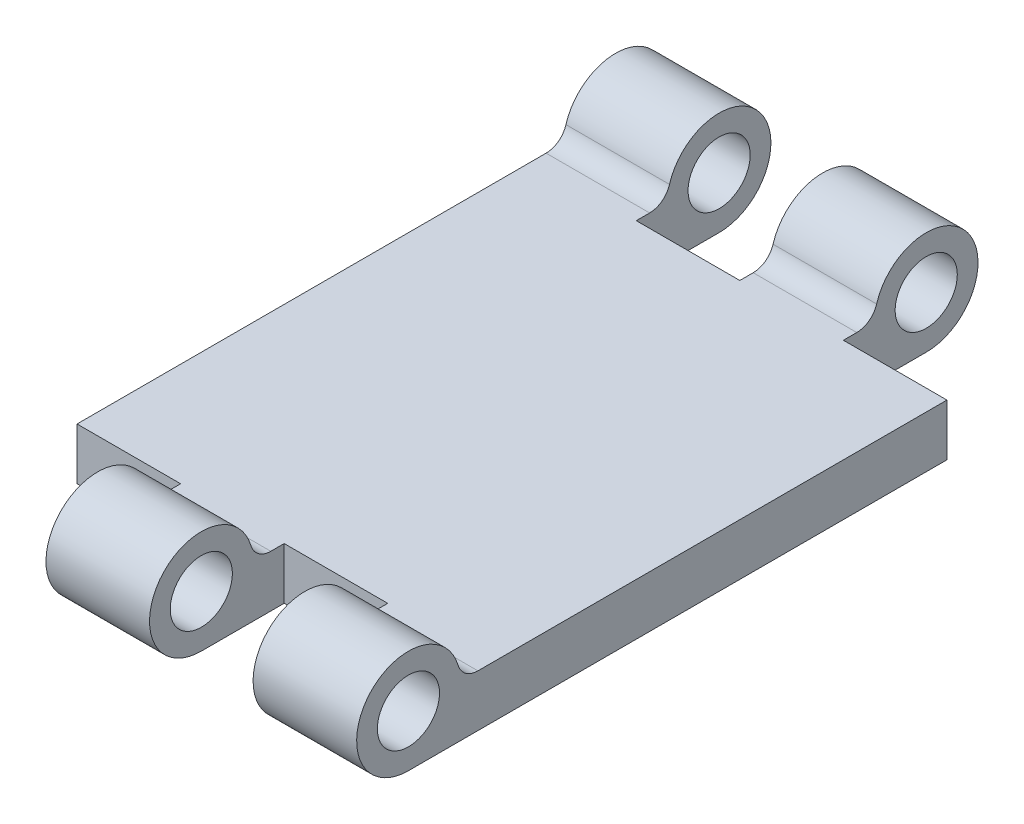
ISO-10303-21;
HEADER;
FILE_DESCRIPTION(('STEP AP214'),'2;1');
FILE_NAME('part.step','',(''),(''),'','','');
FILE_SCHEMA(('AUTOMOTIVE_DESIGN { 1 0 10303 214 1 1 1 1 }'));
ENDSEC;
DATA;
#1=APPLICATION_CONTEXT('core data for automotive mechanical design processes');
#2=APPLICATION_PROTOCOL_DEFINITION('international standard','automotive_design',2000,#1);
#3=PRODUCT_CONTEXT('',#1,'mechanical');
#4=PRODUCT('Part','Part','',(#3));
#5=PRODUCT_RELATED_PRODUCT_CATEGORY('part','',(#4));
#6=PRODUCT_DEFINITION_FORMATION('','',#4);
#7=PRODUCT_DEFINITION_CONTEXT('part definition',#1,'design');
#8=PRODUCT_DEFINITION('design','',#6,#7);
#9=PRODUCT_DEFINITION_SHAPE('','',#8);
#10=(LENGTH_UNIT() NAMED_UNIT(*) SI_UNIT(.MILLI.,.METRE.));
#11=(NAMED_UNIT(*) PLANE_ANGLE_UNIT() SI_UNIT($,.RADIAN.));
#12=(NAMED_UNIT(*) SI_UNIT($,.STERADIAN.) SOLID_ANGLE_UNIT());
#13=UNCERTAINTY_MEASURE_WITH_UNIT(LENGTH_MEASURE(1.E-05),#10,'distance_accuracy_value','');
#14=(GEOMETRIC_REPRESENTATION_CONTEXT(3) GLOBAL_UNCERTAINTY_ASSIGNED_CONTEXT((#13)) GLOBAL_UNIT_ASSIGNED_CONTEXT((#10,
#11,#12)) REPRESENTATION_CONTEXT('',''));
#15=CARTESIAN_POINT('',(0.,0.,0.));
#16=DIRECTION('',(0.,0.,1.));
#17=DIRECTION('',(1.,0.,0.));
#18=AXIS2_PLACEMENT_3D('',#15,#16,#17);
#19=CARTESIAN_POINT('',(500.,-125.,0.));
#20=DIRECTION('',(0.,1.,0.));
#21=DIRECTION('',(0.,0.,1.));
#22=AXIS2_PLACEMENT_3D('',#19,#20,#21);
#23=PLANE('',#22);
#24=DIRECTION('',(0.,0.,1.));
#25=VECTOR('',#24,1.);
#26=CARTESIAN_POINT('',(-250.,-125.,0.));
#27=LINE('',#26,#25);
#28=CARTESIAN_POINT('',(-250.,-125.,1300.));
#29=VERTEX_POINT('',#28);
#30=CARTESIAN_POINT('',(-250.,-125.,1500.));
#31=VERTEX_POINT('',#30);
#32=EDGE_CURVE('E360',#29,#31,#27,.T.);
#33=ORIENTED_EDGE('',*,*,#32,.F.);
#34=DIRECTION('',(1.,0.,0.));
#35=VECTOR('',#34,1.);
#36=CARTESIAN_POINT('',(500.,-125.,1300.));
#37=LINE('',#36,#35);
#38=CARTESIAN_POINT('',(-500.,-125.,1300.));
#39=VERTEX_POINT('',#38);
#40=EDGE_CURVE('E366',#39,#29,#37,.T.);
#41=ORIENTED_EDGE('',*,*,#40,.F.);
#42=DIRECTION('',(0.,0.,-1.));
#43=VECTOR('',#42,1.);
#44=CARTESIAN_POINT('',(-500.,-125.,0.));
#45=LINE('',#44,#43);
#46=CARTESIAN_POINT('',(-500.,-125.,0.));
#47=VERTEX_POINT('',#46);
#48=EDGE_CURVE('E279',#39,#47,#45,.T.);
#49=ORIENTED_EDGE('',*,*,#48,.T.);
#50=DIRECTION('',(1.,0.,0.));
#51=VECTOR('',#50,1.);
#52=CARTESIAN_POINT('',(-500.,-125.,0.));
#53=LINE('',#52,#51);
#54=CARTESIAN_POINT('',(-250.,-125.,0.));
#55=VERTEX_POINT('',#54);
#56=EDGE_CURVE('E332',#47,#55,#53,.T.);
#57=ORIENTED_EDGE('',*,*,#56,.T.);
#58=DIRECTION('',(0.,0.,-1.));
#59=VECTOR('',#58,1.);
#60=CARTESIAN_POINT('',(-250.,-125.,0.));
#61=LINE('',#60,#59);
#62=CARTESIAN_POINT('',(-250.,-125.,200.));
#63=VERTEX_POINT('',#62);
#64=EDGE_CURVE('E254',#63,#55,#61,.T.);
#65=ORIENTED_EDGE('',*,*,#64,.F.);
#66=DIRECTION('',(-1.,0.,0.));
#67=VECTOR('',#66,1.);
#68=CARTESIAN_POINT('',(500.,-125.,200.));
#69=LINE('',#68,#67);
#70=CARTESIAN_POINT('',(0.,-125.,200.));
#71=VERTEX_POINT('',#70);
#72=EDGE_CURVE('E313',#71,#63,#69,.T.);
#73=ORIENTED_EDGE('',*,*,#72,.F.);
#74=DIRECTION('',(0.,0.,1.));
#75=VECTOR('',#74,1.);
#76=CARTESIAN_POINT('',(0.,-125.,0.));
#77=LINE('',#76,#75);
#78=CARTESIAN_POINT('',(0.,-125.,0.));
#79=VERTEX_POINT('',#78);
#80=EDGE_CURVE('E305',#79,#71,#77,.T.);
#81=ORIENTED_EDGE('',*,*,#80,.F.);
#82=DIRECTION('',(-1.,0.,0.));
#83=VECTOR('',#82,1.);
#84=CARTESIAN_POINT('',(250.,-125.,0.));
#85=LINE('',#84,#83);
#86=CARTESIAN_POINT('',(250.,-125.,0.));
#87=VERTEX_POINT('',#86);
#88=EDGE_CURVE('E267',#79,#87,#85,.F.);
#89=ORIENTED_EDGE('',*,*,#88,.T.);
#90=DIRECTION('',(0.,0.,-1.));
#91=VECTOR('',#90,1.);
#92=CARTESIAN_POINT('',(250.,-125.,0.));
#93=LINE('',#92,#91);
#94=CARTESIAN_POINT('',(250.,-125.,200.));
#95=VERTEX_POINT('',#94);
#96=EDGE_CURVE('E253',#95,#87,#93,.T.);
#97=ORIENTED_EDGE('',*,*,#96,.F.);
#98=DIRECTION('',(-1.,0.,0.));
#99=VECTOR('',#98,1.);
#100=CARTESIAN_POINT('',(500.,-125.,200.));
#101=LINE('',#100,#99);
#102=CARTESIAN_POINT('',(500.,-125.,200.));
#103=VERTEX_POINT('',#102);
#104=EDGE_CURVE('E311',#103,#95,#101,.T.);
#105=ORIENTED_EDGE('',*,*,#104,.F.);
#106=DIRECTION('',(0.,0.,-1.));
#107=VECTOR('',#106,1.);
#108=CARTESIAN_POINT('',(500.,-125.,0.));
#109=LINE('',#108,#107);
#110=CARTESIAN_POINT('',(500.,-125.,1500.));
#111=VERTEX_POINT('',#110);
#112=EDGE_CURVE('E280',#111,#103,#109,.T.);
#113=ORIENTED_EDGE('',*,*,#112,.F.);
#114=DIRECTION('',(-1.,0.,0.));
#115=VECTOR('',#114,1.);
#116=CARTESIAN_POINT('',(500.,-125.,1500.));
#117=LINE('',#116,#115);
#118=CARTESIAN_POINT('',(250.,-125.,1500.));
#119=VERTEX_POINT('',#118);
#120=EDGE_CURVE('E287',#111,#119,#117,.T.);
#121=ORIENTED_EDGE('',*,*,#120,.T.);
#122=DIRECTION('',(0.,0.,1.));
#123=VECTOR('',#122,1.);
#124=CARTESIAN_POINT('',(250.,-125.,0.));
#125=LINE('',#124,#123);
#126=CARTESIAN_POINT('',(250.,-125.,1300.));
#127=VERTEX_POINT('',#126);
#128=EDGE_CURVE('E183',#127,#119,#125,.T.);
#129=ORIENTED_EDGE('',*,*,#128,.F.);
#130=DIRECTION('',(1.,0.,0.));
#131=VECTOR('',#130,1.);
#132=CARTESIAN_POINT('',(500.,-125.,1300.));
#133=LINE('',#132,#131);
#134=CARTESIAN_POINT('',(0.,-125.,1300.));
#135=VERTEX_POINT('',#134);
#136=EDGE_CURVE('E192',#135,#127,#133,.T.);
#137=ORIENTED_EDGE('',*,*,#136,.F.);
#138=DIRECTION('',(0.,0.,-1.));
#139=VECTOR('',#138,1.);
#140=CARTESIAN_POINT('',(0.,-125.,0.));
#141=LINE('',#140,#139);
#142=CARTESIAN_POINT('',(0.,-125.,1500.));
#143=VERTEX_POINT('',#142);
#144=EDGE_CURVE('E361',#143,#135,#141,.T.);
#145=ORIENTED_EDGE('',*,*,#144,.F.);
#146=DIRECTION('',(1.,0.,0.));
#147=VECTOR('',#146,1.);
#148=CARTESIAN_POINT('',(-250.,-125.,1500.));
#149=LINE('',#148,#147);
#150=EDGE_CURVE('E274',#31,#143,#149,.T.);
#151=ORIENTED_EDGE('',*,*,#150,.F.);
#152=EDGE_LOOP('',(#33,#41,#49,#57,#65,#73,#81,#89,#97,#105,#113,#121,#129,#137,#145,#151));
#153=FACE_BOUND('',#152,.T.);
#154=ADVANCED_FACE('F35',(#153),#23,.F.);
#155=CARTESIAN_POINT('',(500.,0.,0.));
#156=DIRECTION('',(0.,-1.,0.));
#157=DIRECTION('',(0.,0.,-1.));
#158=AXIS2_PLACEMENT_3D('',#155,#156,#157);
#159=PLANE('',#158);
#160=DIRECTION('',(0.,0.,-1.));
#161=VECTOR('',#160,1.);
#162=CARTESIAN_POINT('',(-250.,0.,0.));
#163=LINE('',#162,#161);
#164=CARTESIAN_POINT('',(-250.,-1.47850983697853E-13,1332.29490168752));
#165=VERTEX_POINT('',#164);
#166=CARTESIAN_POINT('',(-250.,-1.66533453693773E-13,1300.));
#167=VERTEX_POINT('',#166);
#168=EDGE_CURVE('E395',#165,#167,#163,.T.);
#169=ORIENTED_EDGE('',*,*,#168,.F.);
#170=DIRECTION('',(1.,0.,0.));
#171=VECTOR('',#170,1.);
#172=CARTESIAN_POINT('',(500.,-1.47850983697853E-13,1332.29490168752));
#173=LINE('',#172,#171);
#174=CARTESIAN_POINT('',(0.,-1.47850983697853E-13,1332.29490168752));
#175=VERTEX_POINT('',#174);
#176=EDGE_CURVE('E217',#165,#175,#173,.T.);
#177=ORIENTED_EDGE('',*,*,#176,.T.);
#178=DIRECTION('',(0.,0.,1.));
#179=VECTOR('',#178,1.);
#180=CARTESIAN_POINT('',(0.,0.,0.));
#181=LINE('',#180,#179);
#182=CARTESIAN_POINT('',(0.,-1.66533453693773E-13,1300.));
#183=VERTEX_POINT('',#182);
#184=EDGE_CURVE('E199',#183,#175,#181,.T.);
#185=ORIENTED_EDGE('',*,*,#184,.F.);
#186=DIRECTION('',(-1.,0.,0.));
#187=VECTOR('',#186,1.);
#188=CARTESIAN_POINT('',(500.,-1.43895998899814E-13,1300.));
#189=LINE('',#188,#187);
#190=CARTESIAN_POINT('',(250.,-1.66533453693773E-13,1300.));
#191=VERTEX_POINT('',#190);
#192=EDGE_CURVE('E189',#191,#183,#189,.T.);
#193=ORIENTED_EDGE('',*,*,#192,.F.);
#194=DIRECTION('',(0.,0.,-1.));
#195=VECTOR('',#194,1.);
#196=CARTESIAN_POINT('',(250.,0.,0.));
#197=LINE('',#196,#195);
#198=CARTESIAN_POINT('',(250.,-1.47850983697853E-13,1332.29490168752));
#199=VERTEX_POINT('',#198);
#200=EDGE_CURVE('E172',#199,#191,#197,.T.);
#201=ORIENTED_EDGE('',*,*,#200,.F.);
#202=DIRECTION('',(1.,0.,0.));
#203=VECTOR('',#202,1.);
#204=CARTESIAN_POINT('',(500.,-1.47850983697853E-13,1332.29490168752));
#205=LINE('',#204,#203);
#206=CARTESIAN_POINT('',(500.,-1.47850983697853E-13,1332.29490168752));
#207=VERTEX_POINT('',#206);
#208=EDGE_CURVE('E215',#199,#207,#205,.T.);
#209=ORIENTED_EDGE('',*,*,#208,.T.);
#210=DIRECTION('',(0.,0.,1.));
#211=VECTOR('',#210,1.);
#212=CARTESIAN_POINT('',(500.,0.,0.));
#213=LINE('',#212,#211);
#214=CARTESIAN_POINT('',(500.,0.,200.));
#215=VERTEX_POINT('',#214);
#216=EDGE_CURVE('E283',#215,#207,#213,.T.);
#217=ORIENTED_EDGE('',*,*,#216,.F.);
#218=DIRECTION('',(1.,0.,0.));
#219=VECTOR('',#218,1.);
#220=CARTESIAN_POINT('',(500.,0.,200.));
#221=LINE('',#220,#219);
#222=CARTESIAN_POINT('',(250.,0.,200.));
#223=VERTEX_POINT('',#222);
#224=EDGE_CURVE('E252',#223,#215,#221,.T.);
#225=ORIENTED_EDGE('',*,*,#224,.F.);
#226=DIRECTION('',(0.,0.,1.));
#227=VECTOR('',#226,1.);
#228=CARTESIAN_POINT('',(250.,0.,0.));
#229=LINE('',#228,#227);
#230=CARTESIAN_POINT('',(250.,0.,167.705098312484));
#231=VERTEX_POINT('',#230);
#232=EDGE_CURVE('E241',#231,#223,#229,.T.);
#233=ORIENTED_EDGE('',*,*,#232,.F.);
#234=DIRECTION('',(1.,0.,0.));
#235=VECTOR('',#234,1.);
#236=CARTESIAN_POINT('',(0.,0.,167.705098312484));
#237=LINE('',#236,#235);
#238=CARTESIAN_POINT('',(0.,0.,167.705098312484));
#239=VERTEX_POINT('',#238);
#240=EDGE_CURVE('E212',#231,#239,#237,.F.);
#241=ORIENTED_EDGE('',*,*,#240,.T.);
#242=DIRECTION('',(0.,0.,-1.));
#243=VECTOR('',#242,1.);
#244=CARTESIAN_POINT('',(0.,0.,0.));
#245=LINE('',#244,#243);
#246=CARTESIAN_POINT('',(0.,0.,200.));
#247=VERTEX_POINT('',#246);
#248=EDGE_CURVE('E262',#247,#239,#245,.T.);
#249=ORIENTED_EDGE('',*,*,#248,.F.);
#250=DIRECTION('',(1.,0.,0.));
#251=VECTOR('',#250,1.);
#252=CARTESIAN_POINT('',(500.,0.,200.));
#253=LINE('',#252,#251);
#254=CARTESIAN_POINT('',(-250.,0.,200.));
#255=VERTEX_POINT('',#254);
#256=EDGE_CURVE('E206',#255,#247,#253,.T.);
#257=ORIENTED_EDGE('',*,*,#256,.F.);
#258=DIRECTION('',(0.,0.,1.));
#259=VECTOR('',#258,1.);
#260=CARTESIAN_POINT('',(-250.,0.,0.));
#261=LINE('',#260,#259);
#262=CARTESIAN_POINT('',(-250.,0.,167.705098312484));
#263=VERTEX_POINT('',#262);
#264=EDGE_CURVE('E377',#263,#255,#261,.T.);
#265=ORIENTED_EDGE('',*,*,#264,.F.);
#266=DIRECTION('',(1.,0.,0.));
#267=VECTOR('',#266,1.);
#268=CARTESIAN_POINT('',(500.,0.,167.705098312484));
#269=LINE('',#268,#267);
#270=CARTESIAN_POINT('',(-500.,0.,167.705098312484));
#271=VERTEX_POINT('',#270);
#272=EDGE_CURVE('E204',#263,#271,#269,.F.);
#273=ORIENTED_EDGE('',*,*,#272,.T.);
#274=DIRECTION('',(0.,0.,1.));
#275=VECTOR('',#274,1.);
#276=CARTESIAN_POINT('',(-500.,0.,0.));
#277=LINE('',#276,#275);
#278=CARTESIAN_POINT('',(-500.,-1.43895998899814E-13,1300.));
#279=VERTEX_POINT('',#278);
#280=EDGE_CURVE('E284',#271,#279,#277,.T.);
#281=ORIENTED_EDGE('',*,*,#280,.T.);
#282=DIRECTION('',(-1.,0.,0.));
#283=VECTOR('',#282,1.);
#284=CARTESIAN_POINT('',(500.,-1.43895998899814E-13,1300.));
#285=LINE('',#284,#283);
#286=EDGE_CURVE('E363',#167,#279,#285,.T.);
#287=ORIENTED_EDGE('',*,*,#286,.F.);
#288=EDGE_LOOP('',(#169,#177,#185,#193,#201,#209,#217,#225,#233,#241,#249,#257,#265,#273,#281,#287));
#289=FACE_BOUND('',#288,.T.);
#290=ADVANCED_FACE('F197',(#289),#159,.F.);
#291=CARTESIAN_POINT('',(-500.,0.,0.));
#292=DIRECTION('',(1.,0.,0.));
#293=DIRECTION('',(0.,0.,-1.));
#294=AXIS2_PLACEMENT_3D('',#291,#292,#293);
#295=PLANE('',#294);
#296=CARTESIAN_POINT('',(-500.,0.,0.));
#297=DIRECTION('',(1.,0.,0.));
#298=DIRECTION('',(0.,0.,-1.));
#299=AXIS2_PLACEMENT_3D('',#296,#297,#298);
#300=CIRCLE('',#299,75.);
#301=CARTESIAN_POINT('',(-500.,0.,-75.));
#302=VERTEX_POINT('',#301);
#303=EDGE_CURVE('E326',#302,#302,#300,.T.);
#304=ORIENTED_EDGE('',*,*,#303,.T.);
#305=EDGE_LOOP('',(#304));
#306=FACE_BOUND('',#305,.T.);
#307=DIRECTION('',(0.,-1.,0.));
#308=VECTOR('',#307,1.);
#309=CARTESIAN_POINT('',(-500.,0.,1300.));
#310=LINE('',#309,#308);
#311=EDGE_CURVE('E201',#279,#39,#310,.T.);
#312=ORIENTED_EDGE('',*,*,#311,.F.);
#313=ORIENTED_EDGE('',*,*,#280,.F.);
#314=CARTESIAN_POINT('',(-500.,50.,167.705098312484));
#315=DIRECTION('',(1.,0.,0.));
#316=DIRECTION('',(0.,0.,-1.));
#317=AXIS2_PLACEMENT_3D('',#314,#315,#316);
#318=CIRCLE('',#317,50.);
#319=CARTESIAN_POINT('',(-500.,35.7142857142857,119.789355937489));
#320=VERTEX_POINT('',#319);
#321=EDGE_CURVE('E43',#271,#320,#318,.T.);
#322=ORIENTED_EDGE('',*,*,#321,.T.);
#323=CARTESIAN_POINT('',(-500.,0.,0.));
#324=DIRECTION('',(1.,0.,0.));
#325=DIRECTION('',(0.,0.,-1.));
#326=AXIS2_PLACEMENT_3D('',#323,#324,#325);
#327=CIRCLE('',#326,125.);
#328=EDGE_CURVE('E329',#47,#320,#327,.T.);
#329=ORIENTED_EDGE('',*,*,#328,.F.);
#330=ORIENTED_EDGE('',*,*,#48,.F.);
#331=EDGE_LOOP('',(#312,#313,#322,#329,#330));
#332=FACE_BOUND('',#331,.T.);
#333=ADVANCED_FACE('F387',(#306,#332),#295,.F.);
#334=CARTESIAN_POINT('',(500.,0.,0.));
#335=DIRECTION('',(1.,0.,0.));
#336=DIRECTION('',(0.,0.,-1.));
#337=AXIS2_PLACEMENT_3D('',#334,#335,#336);
#338=PLANE('',#337);
#339=CARTESIAN_POINT('',(500.,0.,1500.));
#340=DIRECTION('',(1.,0.,0.));
#341=DIRECTION('',(0.,0.,-1.));
#342=AXIS2_PLACEMENT_3D('',#339,#340,#341);
#343=CIRCLE('',#342,75.);
#344=CARTESIAN_POINT('',(500.,0.,1425.));
#345=VERTEX_POINT('',#344);
#346=EDGE_CURVE('E316',#345,#345,#343,.T.);
#347=ORIENTED_EDGE('',*,*,#346,.F.);
#348=EDGE_LOOP('',(#347));
#349=FACE_BOUND('',#348,.T.);
#350=ORIENTED_EDGE('',*,*,#112,.T.);
#351=DIRECTION('',(0.,1.,0.));
#352=VECTOR('',#351,1.);
#353=CARTESIAN_POINT('',(500.,0.,200.));
#354=LINE('',#353,#352);
#355=EDGE_CURVE('E292',#103,#215,#354,.T.);
#356=ORIENTED_EDGE('',*,*,#355,.T.);
#357=ORIENTED_EDGE('',*,*,#216,.T.);
#358=CARTESIAN_POINT('',(500.,49.9999999999999,1332.29490168752));
#359=DIRECTION('',(1.,0.,0.));
#360=DIRECTION('',(0.,0.,-1.));
#361=AXIS2_PLACEMENT_3D('',#358,#359,#360);
#362=CIRCLE('',#361,50.);
#363=CARTESIAN_POINT('',(500.,35.7142857142856,1380.21064406251));
#364=VERTEX_POINT('',#363);
#365=EDGE_CURVE('E230',#207,#364,#362,.F.);
#366=ORIENTED_EDGE('',*,*,#365,.T.);
#367=CARTESIAN_POINT('',(500.,0.,1500.));
#368=DIRECTION('',(1.,0.,0.));
#369=DIRECTION('',(0.,0.,-1.));
#370=AXIS2_PLACEMENT_3D('',#367,#368,#369);
#371=CIRCLE('',#370,125.);
#372=EDGE_CURVE('E319',#364,#111,#371,.T.);
#373=ORIENTED_EDGE('',*,*,#372,.T.);
#374=EDGE_LOOP('',(#350,#356,#357,#366,#373));
#375=FACE_BOUND('',#374,.T.);
#376=ADVANCED_FACE('F560',(#349,#375),#338,.T.);
#377=CARTESIAN_POINT('',(250.,0.,0.));
#378=DIRECTION('',(-1.,0.,0.));
#379=DIRECTION('',(0.,0.,1.));
#380=AXIS2_PLACEMENT_3D('',#377,#378,#379);
#381=CYLINDRICAL_SURFACE('',#380,75.);
#382=CARTESIAN_POINT('',(250.,0.,0.));
#383=DIRECTION('',(1.,0.,0.));
#384=DIRECTION('',(0.,0.,-1.));
#385=AXIS2_PLACEMENT_3D('',#382,#383,#384);
#386=CIRCLE('',#385,75.);
#387=CARTESIAN_POINT('',(250.,0.,-75.));
#388=VERTEX_POINT('',#387);
#389=EDGE_CURVE('E268',#388,#388,#386,.T.);
#390=ORIENTED_EDGE('',*,*,#389,.T.);
#391=EDGE_LOOP('',(#390));
#392=FACE_BOUND('',#391,.T.);
#393=CARTESIAN_POINT('',(0.,0.,0.));
#394=DIRECTION('',(1.,0.,0.));
#395=DIRECTION('',(0.,0.,-1.));
#396=AXIS2_PLACEMENT_3D('',#393,#394,#395);
#397=CIRCLE('',#396,75.);
#398=CARTESIAN_POINT('',(0.,0.,-75.));
#399=VERTEX_POINT('',#398);
#400=EDGE_CURVE('E269',#399,#399,#397,.T.);
#401=ORIENTED_EDGE('',*,*,#400,.F.);
#402=EDGE_LOOP('',(#401));
#403=FACE_BOUND('',#402,.T.);
#404=ADVANCED_FACE('F553',(#392,#403),#381,.F.);
#405=CARTESIAN_POINT('',(250.,0.,0.));
#406=DIRECTION('',(-1.,0.,0.));
#407=DIRECTION('',(0.,0.,1.));
#408=AXIS2_PLACEMENT_3D('',#405,#406,#407);
#409=CYLINDRICAL_SURFACE('',#408,125.);
#410=CARTESIAN_POINT('',(0.,0.,0.));
#411=DIRECTION('',(1.,0.,0.));
#412=DIRECTION('',(0.,0.,-1.));
#413=AXIS2_PLACEMENT_3D('',#410,#411,#412);
#414=CIRCLE('',#413,125.);
#415=CARTESIAN_POINT('',(0.,35.7142857142857,119.789355937489));
#416=VERTEX_POINT('',#415);
#417=EDGE_CURVE('E261',#79,#416,#414,.T.);
#418=ORIENTED_EDGE('',*,*,#417,.T.);
#419=DIRECTION('',(-1.,0.,0.));
#420=VECTOR('',#419,1.);
#421=CARTESIAN_POINT('',(250.,35.7142857142857,119.789355937489));
#422=LINE('',#421,#420);
#423=CARTESIAN_POINT('',(250.,35.7142857142857,119.789355937489));
#424=VERTEX_POINT('',#423);
#425=EDGE_CURVE('E222',#416,#424,#422,.F.);
#426=ORIENTED_EDGE('',*,*,#425,.T.);
#427=CARTESIAN_POINT('',(250.,0.,0.));
#428=DIRECTION('',(1.,0.,0.));
#429=DIRECTION('',(0.,0.,-1.));
#430=AXIS2_PLACEMENT_3D('',#427,#428,#429);
#431=CIRCLE('',#430,125.);
#432=EDGE_CURVE('E244',#87,#424,#431,.T.);
#433=ORIENTED_EDGE('',*,*,#432,.F.);
#434=ORIENTED_EDGE('',*,*,#88,.F.);
#435=EDGE_LOOP('',(#418,#426,#433,#434));
#436=FACE_BOUND('',#435,.T.);
#437=ADVANCED_FACE('F265',(#436),#409,.T.);
#438=CARTESIAN_POINT('',(250.,0.,0.));
#439=DIRECTION('',(1.,0.,0.));
#440=DIRECTION('',(0.,0.,-1.));
#441=AXIS2_PLACEMENT_3D('',#438,#439,#440);
#442=PLANE('',#441);
#443=ORIENTED_EDGE('',*,*,#389,.F.);
#444=EDGE_LOOP('',(#443));
#445=FACE_BOUND('',#444,.T.);
#446=ORIENTED_EDGE('',*,*,#432,.T.);
#447=CARTESIAN_POINT('',(250.,50.,167.705098312484));
#448=DIRECTION('',(1.,0.,0.));
#449=DIRECTION('',(0.,0.,-1.));
#450=AXIS2_PLACEMENT_3D('',#447,#448,#449);
#451=CIRCLE('',#450,50.);
#452=EDGE_CURVE('E234',#424,#231,#451,.F.);
#453=ORIENTED_EDGE('',*,*,#452,.T.);
#454=ORIENTED_EDGE('',*,*,#232,.T.);
#455=DIRECTION('',(0.,-1.,0.));
#456=VECTOR('',#455,1.);
#457=CARTESIAN_POINT('',(250.,250.,200.));
#458=LINE('',#457,#456);
#459=EDGE_CURVE('E373',#223,#95,#458,.T.);
#460=ORIENTED_EDGE('',*,*,#459,.T.);
#461=ORIENTED_EDGE('',*,*,#96,.T.);
#462=EDGE_LOOP('',(#446,#453,#454,#460,#461));
#463=FACE_BOUND('',#462,.T.);
#464=ADVANCED_FACE('F239',(#445,#463),#442,.T.);
#465=CARTESIAN_POINT('',(0.,0.,0.));
#466=DIRECTION('',(1.,0.,0.));
#467=DIRECTION('',(0.,0.,-1.));
#468=AXIS2_PLACEMENT_3D('',#465,#466,#467);
#469=PLANE('',#468);
#470=ORIENTED_EDGE('',*,*,#400,.T.);
#471=EDGE_LOOP('',(#470));
#472=FACE_BOUND('',#471,.T.);
#473=ORIENTED_EDGE('',*,*,#417,.F.);
#474=ORIENTED_EDGE('',*,*,#80,.T.);
#475=DIRECTION('',(0.,-1.,0.));
#476=VECTOR('',#475,1.);
#477=CARTESIAN_POINT('',(0.,250.,200.));
#478=LINE('',#477,#476);
#479=EDGE_CURVE('E300',#247,#71,#478,.T.);
#480=ORIENTED_EDGE('',*,*,#479,.F.);
#481=ORIENTED_EDGE('',*,*,#248,.T.);
#482=CARTESIAN_POINT('',(0.,50.,167.705098312484));
#483=DIRECTION('',(1.,0.,0.));
#484=DIRECTION('',(0.,0.,-1.));
#485=AXIS2_PLACEMENT_3D('',#482,#483,#484);
#486=CIRCLE('',#485,50.);
#487=EDGE_CURVE('E232',#239,#416,#486,.T.);
#488=ORIENTED_EDGE('',*,*,#487,.T.);
#489=EDGE_LOOP('',(#473,#474,#480,#481,#488));
#490=FACE_BOUND('',#489,.T.);
#491=ADVANCED_FACE('F260',(#472,#490),#469,.F.);
#492=CARTESIAN_POINT('',(-250.,0.,1500.));
#493=DIRECTION('',(1.,0.,0.));
#494=DIRECTION('',(0.,0.,-1.));
#495=AXIS2_PLACEMENT_3D('',#492,#493,#494);
#496=CYLINDRICAL_SURFACE('',#495,75.);
#497=CARTESIAN_POINT('',(-250.,0.,1500.));
#498=DIRECTION('',(1.,0.,0.));
#499=DIRECTION('',(0.,0.,-1.));
#500=AXIS2_PLACEMENT_3D('',#497,#498,#499);
#501=CIRCLE('',#500,75.);
#502=CARTESIAN_POINT('',(-250.,0.,1425.));
#503=VERTEX_POINT('',#502);
#504=EDGE_CURVE('E339',#503,#503,#501,.T.);
#505=ORIENTED_EDGE('',*,*,#504,.F.);
#506=EDGE_LOOP('',(#505));
#507=FACE_BOUND('',#506,.T.);
#508=CARTESIAN_POINT('',(0.,0.,1500.));
#509=DIRECTION('',(1.,0.,0.));
#510=DIRECTION('',(0.,0.,-1.));
#511=AXIS2_PLACEMENT_3D('',#508,#509,#510);
#512=CIRCLE('',#511,75.);
#513=CARTESIAN_POINT('',(0.,0.,1425.));
#514=VERTEX_POINT('',#513);
#515=EDGE_CURVE('E338',#514,#514,#512,.T.);
#516=ORIENTED_EDGE('',*,*,#515,.T.);
#517=EDGE_LOOP('',(#516));
#518=FACE_BOUND('',#517,.T.);
#519=ADVANCED_FACE('F416',(#507,#518),#496,.F.);
#520=CARTESIAN_POINT('',(-250.,0.,1500.));
#521=DIRECTION('',(1.,0.,0.));
#522=DIRECTION('',(0.,0.,-1.));
#523=AXIS2_PLACEMENT_3D('',#520,#521,#522);
#524=CYLINDRICAL_SURFACE('',#523,125.);
#525=CARTESIAN_POINT('',(0.,0.,1500.));
#526=DIRECTION('',(1.,0.,0.));
#527=DIRECTION('',(0.,0.,-1.));
#528=AXIS2_PLACEMENT_3D('',#525,#526,#527);
#529=CIRCLE('',#528,125.);
#530=CARTESIAN_POINT('',(0.,35.7142857142856,1380.21064406251));
#531=VERTEX_POINT('',#530);
#532=EDGE_CURVE('E343',#531,#143,#529,.T.);
#533=ORIENTED_EDGE('',*,*,#532,.F.);
#534=DIRECTION('',(1.,0.,0.));
#535=VECTOR('',#534,1.);
#536=CARTESIAN_POINT('',(-250.,35.7142857142856,1380.21064406251));
#537=LINE('',#536,#535);
#538=CARTESIAN_POINT('',(-250.,35.7142857142856,1380.21064406251));
#539=VERTEX_POINT('',#538);
#540=EDGE_CURVE('E200',#531,#539,#537,.F.);
#541=ORIENTED_EDGE('',*,*,#540,.T.);
#542=CARTESIAN_POINT('',(-250.,0.,1500.));
#543=DIRECTION('',(1.,0.,0.));
#544=DIRECTION('',(0.,0.,-1.));
#545=AXIS2_PLACEMENT_3D('',#542,#543,#544);
#546=CIRCLE('',#545,125.);
#547=EDGE_CURVE('E342',#539,#31,#546,.T.);
#548=ORIENTED_EDGE('',*,*,#547,.T.);
#549=ORIENTED_EDGE('',*,*,#150,.T.);
#550=EDGE_LOOP('',(#533,#541,#548,#549));
#551=FACE_BOUND('',#550,.T.);
#552=ADVANCED_FACE('F352',(#551),#524,.T.);
#553=CARTESIAN_POINT('',(-250.,0.,0.));
#554=DIRECTION('',(1.,0.,0.));
#555=DIRECTION('',(0.,0.,-1.));
#556=AXIS2_PLACEMENT_3D('',#553,#554,#555);
#557=PLANE('',#556);
#558=ORIENTED_EDGE('',*,*,#504,.T.);
#559=EDGE_LOOP('',(#558));
#560=FACE_BOUND('',#559,.T.);
#561=ORIENTED_EDGE('',*,*,#547,.F.);
#562=CARTESIAN_POINT('',(-250.,49.9999999999999,1332.29490168752));
#563=DIRECTION('',(1.,0.,0.));
#564=DIRECTION('',(0.,0.,-1.));
#565=AXIS2_PLACEMENT_3D('',#562,#563,#564);
#566=CIRCLE('',#565,50.);
#567=EDGE_CURVE('E225',#539,#165,#566,.T.);
#568=ORIENTED_EDGE('',*,*,#567,.T.);
#569=ORIENTED_EDGE('',*,*,#168,.T.);
#570=DIRECTION('',(0.,-1.,0.));
#571=VECTOR('',#570,1.);
#572=CARTESIAN_POINT('',(-250.,250.,1300.));
#573=LINE('',#572,#571);
#574=EDGE_CURVE('E193',#167,#29,#573,.T.);
#575=ORIENTED_EDGE('',*,*,#574,.T.);
#576=ORIENTED_EDGE('',*,*,#32,.T.);
#577=EDGE_LOOP('',(#561,#568,#569,#575,#576));
#578=FACE_BOUND('',#577,.T.);
#579=ADVANCED_FACE('F406',(#560,#578),#557,.F.);
#580=CARTESIAN_POINT('',(0.,0.,0.));
#581=DIRECTION('',(1.,0.,0.));
#582=DIRECTION('',(0.,0.,-1.));
#583=AXIS2_PLACEMENT_3D('',#580,#581,#582);
#584=PLANE('',#583);
#585=ORIENTED_EDGE('',*,*,#515,.F.);
#586=EDGE_LOOP('',(#585));
#587=FACE_BOUND('',#586,.T.);
#588=ORIENTED_EDGE('',*,*,#184,.T.);
#589=CARTESIAN_POINT('',(0.,49.9999999999999,1332.29490168752));
#590=DIRECTION('',(1.,0.,0.));
#591=DIRECTION('',(0.,0.,-1.));
#592=AXIS2_PLACEMENT_3D('',#589,#590,#591);
#593=CIRCLE('',#592,50.);
#594=EDGE_CURVE('E227',#175,#531,#593,.F.);
#595=ORIENTED_EDGE('',*,*,#594,.T.);
#596=ORIENTED_EDGE('',*,*,#532,.T.);
#597=ORIENTED_EDGE('',*,*,#144,.T.);
#598=DIRECTION('',(0.,-1.,0.));
#599=VECTOR('',#598,1.);
#600=CARTESIAN_POINT('',(0.,250.,1300.));
#601=LINE('',#600,#599);
#602=EDGE_CURVE('E184',#183,#135,#601,.T.);
#603=ORIENTED_EDGE('',*,*,#602,.F.);
#604=EDGE_LOOP('',(#588,#595,#596,#597,#603));
#605=FACE_BOUND('',#604,.T.);
#606=ADVANCED_FACE('F402',(#587,#605),#584,.T.);
#607=CARTESIAN_POINT('',(-500.,0.,0.));
#608=DIRECTION('',(1.,0.,0.));
#609=DIRECTION('',(0.,0.,-1.));
#610=AXIS2_PLACEMENT_3D('',#607,#608,#609);
#611=CYLINDRICAL_SURFACE('',#610,125.);
#612=ORIENTED_EDGE('',*,*,#328,.T.);
#613=DIRECTION('',(1.,0.,0.));
#614=VECTOR('',#613,1.);
#615=CARTESIAN_POINT('',(-500.,35.7142857142857,119.789355937489));
#616=LINE('',#615,#614);
#617=CARTESIAN_POINT('',(-250.,35.7142857142857,119.789355937489));
#618=VERTEX_POINT('',#617);
#619=EDGE_CURVE('E50',#320,#618,#616,.T.);
#620=ORIENTED_EDGE('',*,*,#619,.T.);
#621=CARTESIAN_POINT('',(-250.,0.,0.));
#622=DIRECTION('',(1.,0.,0.));
#623=DIRECTION('',(0.,0.,-1.));
#624=AXIS2_PLACEMENT_3D('',#621,#622,#623);
#625=CIRCLE('',#624,125.);
#626=EDGE_CURVE('E330',#55,#618,#625,.T.);
#627=ORIENTED_EDGE('',*,*,#626,.F.);
#628=ORIENTED_EDGE('',*,*,#56,.F.);
#629=EDGE_LOOP('',(#612,#620,#627,#628));
#630=FACE_BOUND('',#629,.T.);
#631=ADVANCED_FACE('F384',(#630),#611,.T.);
#632=CARTESIAN_POINT('',(-500.,0.,0.));
#633=DIRECTION('',(1.,0.,0.));
#634=DIRECTION('',(0.,0.,-1.));
#635=AXIS2_PLACEMENT_3D('',#632,#633,#634);
#636=CYLINDRICAL_SURFACE('',#635,75.);
#637=ORIENTED_EDGE('',*,*,#303,.F.);
#638=EDGE_LOOP('',(#637));
#639=FACE_BOUND('',#638,.T.);
#640=CARTESIAN_POINT('',(-250.,0.,0.));
#641=DIRECTION('',(1.,0.,0.));
#642=DIRECTION('',(0.,0.,-1.));
#643=AXIS2_PLACEMENT_3D('',#640,#641,#642);
#644=CIRCLE('',#643,75.);
#645=CARTESIAN_POINT('',(-250.,0.,-75.));
#646=VERTEX_POINT('',#645);
#647=EDGE_CURVE('E322',#646,#646,#644,.T.);
#648=ORIENTED_EDGE('',*,*,#647,.T.);
#649=EDGE_LOOP('',(#648));
#650=FACE_BOUND('',#649,.T.);
#651=ADVANCED_FACE('F492',(#639,#650),#636,.F.);
#652=CARTESIAN_POINT('',(-250.,0.,0.));
#653=DIRECTION('',(1.,0.,0.));
#654=DIRECTION('',(0.,0.,-1.));
#655=AXIS2_PLACEMENT_3D('',#652,#653,#654);
#656=PLANE('',#655);
#657=ORIENTED_EDGE('',*,*,#647,.F.);
#658=EDGE_LOOP('',(#657));
#659=FACE_BOUND('',#658,.T.);
#660=ORIENTED_EDGE('',*,*,#626,.T.);
#661=CARTESIAN_POINT('',(-250.,50.,167.705098312484));
#662=DIRECTION('',(1.,0.,0.));
#663=DIRECTION('',(0.,0.,-1.));
#664=AXIS2_PLACEMENT_3D('',#661,#662,#663);
#665=CIRCLE('',#664,50.);
#666=EDGE_CURVE('E11',#618,#263,#665,.F.);
#667=ORIENTED_EDGE('',*,*,#666,.T.);
#668=ORIENTED_EDGE('',*,*,#264,.T.);
#669=DIRECTION('',(0.,-1.,0.));
#670=VECTOR('',#669,1.);
#671=CARTESIAN_POINT('',(-250.,250.,200.));
#672=LINE('',#671,#670);
#673=EDGE_CURVE('E303',#255,#63,#672,.T.);
#674=ORIENTED_EDGE('',*,*,#673,.T.);
#675=ORIENTED_EDGE('',*,*,#64,.T.);
#676=EDGE_LOOP('',(#660,#667,#668,#674,#675));
#677=FACE_BOUND('',#676,.T.);
#678=ADVANCED_FACE('F381',(#659,#677),#656,.T.);
#679=CARTESIAN_POINT('',(500.,0.,1500.));
#680=DIRECTION('',(-1.,0.,0.));
#681=DIRECTION('',(0.,0.,1.));
#682=AXIS2_PLACEMENT_3D('',#679,#680,#681);
#683=CYLINDRICAL_SURFACE('',#682,125.);
#684=ORIENTED_EDGE('',*,*,#372,.F.);
#685=DIRECTION('',(-1.,0.,0.));
#686=VECTOR('',#685,1.);
#687=CARTESIAN_POINT('',(500.,35.7142857142856,1380.21064406251));
#688=LINE('',#687,#686);
#689=CARTESIAN_POINT('',(250.,35.7142857142856,1380.21064406251));
#690=VERTEX_POINT('',#689);
#691=EDGE_CURVE('E219',#364,#690,#688,.T.);
#692=ORIENTED_EDGE('',*,*,#691,.T.);
#693=CARTESIAN_POINT('',(250.,0.,1500.));
#694=DIRECTION('',(1.,0.,0.));
#695=DIRECTION('',(0.,0.,-1.));
#696=AXIS2_PLACEMENT_3D('',#693,#694,#695);
#697=CIRCLE('',#696,125.);
#698=EDGE_CURVE('E320',#690,#119,#697,.T.);
#699=ORIENTED_EDGE('',*,*,#698,.T.);
#700=ORIENTED_EDGE('',*,*,#120,.F.);
#701=EDGE_LOOP('',(#684,#692,#699,#700));
#702=FACE_BOUND('',#701,.T.);
#703=ADVANCED_FACE('F477',(#702),#683,.T.);
#704=CARTESIAN_POINT('',(500.,0.,1500.));
#705=DIRECTION('',(-1.,0.,0.));
#706=DIRECTION('',(0.,0.,1.));
#707=AXIS2_PLACEMENT_3D('',#704,#705,#706);
#708=CYLINDRICAL_SURFACE('',#707,75.);
#709=ORIENTED_EDGE('',*,*,#346,.T.);
#710=EDGE_LOOP('',(#709));
#711=FACE_BOUND('',#710,.T.);
#712=CARTESIAN_POINT('',(250.,0.,1500.));
#713=DIRECTION('',(1.,0.,0.));
#714=DIRECTION('',(0.,0.,-1.));
#715=AXIS2_PLACEMENT_3D('',#712,#713,#714);
#716=CIRCLE('',#715,75.);
#717=CARTESIAN_POINT('',(250.,0.,1425.));
#718=VERTEX_POINT('',#717);
#719=EDGE_CURVE('E315',#718,#718,#716,.T.);
#720=ORIENTED_EDGE('',*,*,#719,.F.);
#721=EDGE_LOOP('',(#720));
#722=FACE_BOUND('',#721,.T.);
#723=ADVANCED_FACE('F466',(#711,#722),#708,.F.);
#724=CARTESIAN_POINT('',(250.,0.,0.));
#725=DIRECTION('',(1.,0.,0.));
#726=DIRECTION('',(0.,0.,-1.));
#727=AXIS2_PLACEMENT_3D('',#724,#725,#726);
#728=PLANE('',#727);
#729=ORIENTED_EDGE('',*,*,#719,.T.);
#730=EDGE_LOOP('',(#729));
#731=FACE_BOUND('',#730,.T.);
#732=ORIENTED_EDGE('',*,*,#698,.F.);
#733=CARTESIAN_POINT('',(250.,49.9999999999999,1332.29490168752));
#734=DIRECTION('',(1.,0.,0.));
#735=DIRECTION('',(0.,0.,-1.));
#736=AXIS2_PLACEMENT_3D('',#733,#734,#735);
#737=CIRCLE('',#736,50.);
#738=EDGE_CURVE('E179',#690,#199,#737,.T.);
#739=ORIENTED_EDGE('',*,*,#738,.T.);
#740=ORIENTED_EDGE('',*,*,#200,.T.);
#741=DIRECTION('',(0.,-1.,0.));
#742=VECTOR('',#741,1.);
#743=CARTESIAN_POINT('',(250.,250.,1300.));
#744=LINE('',#743,#742);
#745=EDGE_CURVE('E177',#191,#127,#744,.T.);
#746=ORIENTED_EDGE('',*,*,#745,.T.);
#747=ORIENTED_EDGE('',*,*,#128,.T.);
#748=EDGE_LOOP('',(#732,#739,#740,#746,#747));
#749=FACE_BOUND('',#748,.T.);
#750=ADVANCED_FACE('F175',(#731,#749),#728,.F.);
#751=CARTESIAN_POINT('',(250.,250.,200.));
#752=DIRECTION('',(0.,0.,-1.));
#753=DIRECTION('',(-1.,0.,0.));
#754=AXIS2_PLACEMENT_3D('',#751,#752,#753);
#755=PLANE('',#754);
#756=ORIENTED_EDGE('',*,*,#104,.T.);
#757=ORIENTED_EDGE('',*,*,#459,.F.);
#758=ORIENTED_EDGE('',*,*,#224,.T.);
#759=ORIENTED_EDGE('',*,*,#355,.F.);
#760=EDGE_LOOP('',(#756,#757,#758,#759));
#761=FACE_BOUND('',#760,.T.);
#762=ADVANCED_FACE('F465',(#761),#755,.T.);
#763=CARTESIAN_POINT('',(-250.,250.,200.));
#764=DIRECTION('',(0.,0.,-1.));
#765=DIRECTION('',(-1.,0.,0.));
#766=AXIS2_PLACEMENT_3D('',#763,#764,#765);
#767=PLANE('',#766);
#768=ORIENTED_EDGE('',*,*,#72,.T.);
#769=ORIENTED_EDGE('',*,*,#673,.F.);
#770=ORIENTED_EDGE('',*,*,#256,.T.);
#771=ORIENTED_EDGE('',*,*,#479,.T.);
#772=EDGE_LOOP('',(#768,#769,#770,#771));
#773=FACE_BOUND('',#772,.T.);
#774=ADVANCED_FACE('F299',(#773),#767,.T.);
#775=CARTESIAN_POINT('',(-250.,250.,1300.));
#776=DIRECTION('',(0.,0.,1.));
#777=DIRECTION('',(1.,0.,0.));
#778=AXIS2_PLACEMENT_3D('',#775,#776,#777);
#779=PLANE('',#778);
#780=ORIENTED_EDGE('',*,*,#40,.T.);
#781=ORIENTED_EDGE('',*,*,#574,.F.);
#782=ORIENTED_EDGE('',*,*,#286,.T.);
#783=ORIENTED_EDGE('',*,*,#311,.T.);
#784=EDGE_LOOP('',(#780,#781,#782,#783));
#785=FACE_BOUND('',#784,.T.);
#786=ADVANCED_FACE('F392',(#785),#779,.T.);
#787=CARTESIAN_POINT('',(250.,250.,1300.));
#788=DIRECTION('',(0.,0.,1.));
#789=DIRECTION('',(1.,0.,0.));
#790=AXIS2_PLACEMENT_3D('',#787,#788,#789);
#791=PLANE('',#790);
#792=ORIENTED_EDGE('',*,*,#136,.T.);
#793=ORIENTED_EDGE('',*,*,#745,.F.);
#794=ORIENTED_EDGE('',*,*,#192,.T.);
#795=ORIENTED_EDGE('',*,*,#602,.T.);
#796=EDGE_LOOP('',(#792,#793,#794,#795));
#797=FACE_BOUND('',#796,.T.);
#798=ADVANCED_FACE('F187',(#797),#791,.T.);
#799=CARTESIAN_POINT('',(-250.,49.9999999999999,1332.29490168752));
#800=DIRECTION('',(1.,0.,0.));
#801=DIRECTION('',(0.,0.,-1.));
#802=AXIS2_PLACEMENT_3D('',#799,#800,#801);
#803=CYLINDRICAL_SURFACE('',#802,50.);
#804=ORIENTED_EDGE('',*,*,#594,.F.);
#805=ORIENTED_EDGE('',*,*,#176,.F.);
#806=ORIENTED_EDGE('',*,*,#567,.F.);
#807=ORIENTED_EDGE('',*,*,#540,.F.);
#808=EDGE_LOOP('',(#804,#805,#806,#807));
#809=FACE_BOUND('',#808,.T.);
#810=ADVANCED_FACE('F401',(#809),#803,.F.);
#811=CARTESIAN_POINT('',(500.,49.9999999999999,1332.29490168752));
#812=DIRECTION('',(-1.,0.,0.));
#813=DIRECTION('',(0.,0.,1.));
#814=AXIS2_PLACEMENT_3D('',#811,#812,#813);
#815=CYLINDRICAL_SURFACE('',#814,50.);
#816=ORIENTED_EDGE('',*,*,#365,.F.);
#817=ORIENTED_EDGE('',*,*,#208,.F.);
#818=ORIENTED_EDGE('',*,*,#738,.F.);
#819=ORIENTED_EDGE('',*,*,#691,.F.);
#820=EDGE_LOOP('',(#816,#817,#818,#819));
#821=FACE_BOUND('',#820,.T.);
#822=ADVANCED_FACE('F429',(#821),#815,.F.);
#823=CARTESIAN_POINT('',(250.,50.,167.705098312484));
#824=DIRECTION('',(-1.,0.,0.));
#825=DIRECTION('',(0.,0.,1.));
#826=AXIS2_PLACEMENT_3D('',#823,#824,#825);
#827=CYLINDRICAL_SURFACE('',#826,50.);
#828=ORIENTED_EDGE('',*,*,#452,.F.);
#829=ORIENTED_EDGE('',*,*,#425,.F.);
#830=ORIENTED_EDGE('',*,*,#487,.F.);
#831=ORIENTED_EDGE('',*,*,#240,.F.);
#832=EDGE_LOOP('',(#828,#829,#830,#831));
#833=FACE_BOUND('',#832,.T.);
#834=ADVANCED_FACE('F256',(#833),#827,.F.);
#835=CARTESIAN_POINT('',(-500.,50.,167.705098312484));
#836=DIRECTION('',(1.,0.,0.));
#837=DIRECTION('',(0.,0.,-1.));
#838=AXIS2_PLACEMENT_3D('',#835,#836,#837);
#839=CYLINDRICAL_SURFACE('',#838,50.);
#840=ORIENTED_EDGE('',*,*,#666,.F.);
#841=ORIENTED_EDGE('',*,*,#619,.F.);
#842=ORIENTED_EDGE('',*,*,#321,.F.);
#843=ORIENTED_EDGE('',*,*,#272,.F.);
#844=EDGE_LOOP('',(#840,#841,#842,#843));
#845=FACE_BOUND('',#844,.T.);
#846=ADVANCED_FACE('F37',(#845),#839,.F.);
#847=CLOSED_SHELL('',(#154,#290,#333,#376,#404,#437,#464,#491,#519,#552,#579,#606,#631,#651,
#678,#703,#723,#750,#762,#774,#786,#798,#810,#822,#834,#846));
#848=MANIFOLD_SOLID_BREP('B2',#847);
#849=ADVANCED_BREP_SHAPE_REPRESENTATION('',(#18,#848),#14);
#850=SHAPE_DEFINITION_REPRESENTATION(#9,#849);
ENDSEC;
END-ISO-10303-21;
